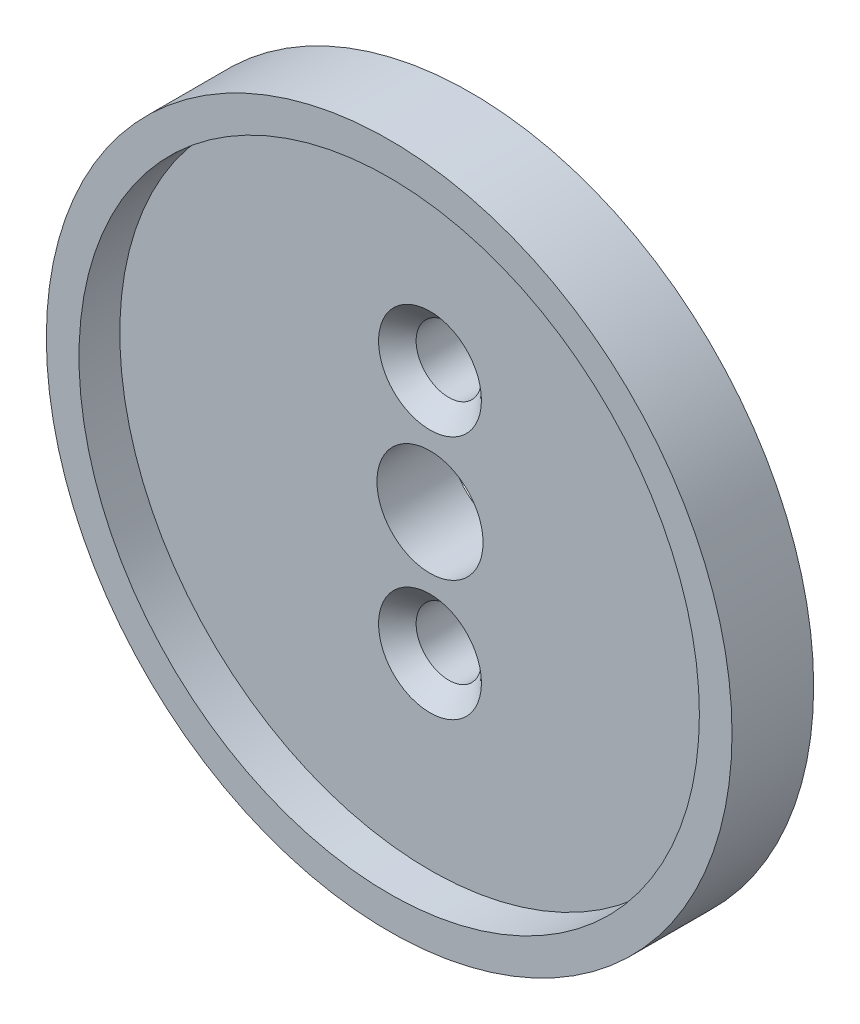
ISO-10303-21;
HEADER;
FILE_DESCRIPTION(('STEP AP214'),'2;1');
FILE_NAME('part.step','',(''),(''),'','','');
FILE_SCHEMA(('AUTOMOTIVE_DESIGN { 1 0 10303 214 1 1 1 1 }'));
ENDSEC;
DATA;
#1=APPLICATION_CONTEXT('core data for automotive mechanical design processes');
#2=APPLICATION_PROTOCOL_DEFINITION('international standard','automotive_design',2000,#1);
#3=PRODUCT_CONTEXT('',#1,'mechanical');
#4=PRODUCT('Part','Part','',(#3));
#5=PRODUCT_RELATED_PRODUCT_CATEGORY('part','',(#4));
#6=PRODUCT_DEFINITION_FORMATION('','',#4);
#7=PRODUCT_DEFINITION_CONTEXT('part definition',#1,'design');
#8=PRODUCT_DEFINITION('design','',#6,#7);
#9=PRODUCT_DEFINITION_SHAPE('','',#8);
#10=(LENGTH_UNIT() NAMED_UNIT(*) SI_UNIT(.MILLI.,.METRE.));
#11=(NAMED_UNIT(*) PLANE_ANGLE_UNIT() SI_UNIT($,.RADIAN.));
#12=(NAMED_UNIT(*) SI_UNIT($,.STERADIAN.) SOLID_ANGLE_UNIT());
#13=UNCERTAINTY_MEASURE_WITH_UNIT(LENGTH_MEASURE(1.E-05),#10,'distance_accuracy_value','');
#14=(GEOMETRIC_REPRESENTATION_CONTEXT(3) GLOBAL_UNCERTAINTY_ASSIGNED_CONTEXT((#13)) GLOBAL_UNIT_ASSIGNED_CONTEXT((#10,
#11,#12)) REPRESENTATION_CONTEXT('',''));
#15=CARTESIAN_POINT('',(0.,0.,0.));
#16=DIRECTION('',(0.,0.,1.));
#17=DIRECTION('',(1.,0.,0.));
#18=AXIS2_PLACEMENT_3D('',#15,#16,#17);
#19=CARTESIAN_POINT('',(12.5,-21.01,25.));
#20=DIRECTION('',(0.,0.,-1.));
#21=DIRECTION('',(-1.,0.,0.));
#22=AXIS2_PLACEMENT_3D('',#19,#20,#21);
#23=PLANE('',#22);
#24=CARTESIAN_POINT('',(0.,0.,25.));
#25=DIRECTION('',(0.,0.,-1.));
#26=DIRECTION('',(-1.,0.,0.));
#27=AXIS2_PLACEMENT_3D('',#24,#25,#26);
#28=CIRCLE('',#27,3.25);
#29=CARTESIAN_POINT('',(-3.25,0.,25.));
#30=VERTEX_POINT('',#29);
#31=EDGE_CURVE('E65',#30,#30,#28,.F.);
#32=ORIENTED_EDGE('',*,*,#31,.T.);
#33=EDGE_LOOP('',(#32));
#34=FACE_BOUND('',#33,.T.);
#35=CARTESIAN_POINT('',(0.,-7.5,25.));
#36=DIRECTION('',(0.,0.,-1.));
#37=DIRECTION('',(-1.,0.,0.));
#38=AXIS2_PLACEMENT_3D('',#35,#36,#37);
#39=CIRCLE('',#38,2.);
#40=CARTESIAN_POINT('',(-2.,-7.5,25.));
#41=VERTEX_POINT('',#40);
#42=EDGE_CURVE('E49',#41,#41,#39,.F.);
#43=ORIENTED_EDGE('',*,*,#42,.T.);
#44=EDGE_LOOP('',(#43));
#45=FACE_BOUND('',#44,.T.);
#46=CARTESIAN_POINT('',(0.,7.5,25.));
#47=DIRECTION('',(0.,0.,-1.));
#48=DIRECTION('',(-1.,0.,0.));
#49=AXIS2_PLACEMENT_3D('',#46,#47,#48);
#50=CIRCLE('',#49,2.);
#51=CARTESIAN_POINT('',(-2.,7.5,25.));
#52=VERTEX_POINT('',#51);
#53=EDGE_CURVE('E69',#52,#52,#50,.F.);
#54=ORIENTED_EDGE('',*,*,#53,.T.);
#55=EDGE_LOOP('',(#54));
#56=FACE_BOUND('',#55,.T.);
#57=CARTESIAN_POINT('',(0.,0.,25.));
#58=DIRECTION('',(0.,0.,-1.));
#59=DIRECTION('',(-1.,0.,0.));
#60=AXIS2_PLACEMENT_3D('',#57,#58,#59);
#61=CIRCLE('',#60,16.7109861589809);
#62=CARTESIAN_POINT('',(-16.7109861589809,0.,25.));
#63=VERTEX_POINT('',#62);
#64=EDGE_CURVE('E130',#63,#63,#61,.T.);
#65=ORIENTED_EDGE('',*,*,#64,.T.);
#66=EDGE_LOOP('',(#65));
#67=FACE_BOUND('',#66,.T.);
#68=ADVANCED_FACE('F45',(#34,#45,#56,#67),#23,.T.);
#69=CARTESIAN_POINT('',(0.,0.,29.5));
#70=DIRECTION('',(0.,0.,1.));
#71=DIRECTION('',(1.,0.,0.));
#72=AXIS2_PLACEMENT_3D('',#69,#70,#71);
#73=CYLINDRICAL_SURFACE('',#72,19.);
#74=CARTESIAN_POINT('',(0.,0.,29.5));
#75=DIRECTION('',(0.,0.,1.));
#76=DIRECTION('',(1.,0.,0.));
#77=AXIS2_PLACEMENT_3D('',#74,#75,#76);
#78=CIRCLE('',#77,19.);
#79=CARTESIAN_POINT('',(19.,0.,29.5));
#80=VERTEX_POINT('',#79);
#81=EDGE_CURVE('E145',#80,#80,#78,.T.);
#82=ORIENTED_EDGE('',*,*,#81,.F.);
#83=EDGE_LOOP('',(#82));
#84=FACE_BOUND('',#83,.T.);
#85=CARTESIAN_POINT('',(0.,0.,32.));
#86=DIRECTION('',(0.,0.,1.));
#87=DIRECTION('',(1.,0.,0.));
#88=AXIS2_PLACEMENT_3D('',#85,#86,#87);
#89=CIRCLE('',#88,19.);
#90=CARTESIAN_POINT('',(19.,0.,32.));
#91=VERTEX_POINT('',#90);
#92=EDGE_CURVE('E147',#91,#91,#89,.T.);
#93=ORIENTED_EDGE('',*,*,#92,.T.);
#94=EDGE_LOOP('',(#93));
#95=FACE_BOUND('',#94,.T.);
#96=ADVANCED_FACE('F94',(#84,#95),#73,.F.);
#97=CARTESIAN_POINT('',(0.,0.,29.5));
#98=DIRECTION('',(0.,0.,1.));
#99=DIRECTION('',(1.,0.,0.));
#100=AXIS2_PLACEMENT_3D('',#97,#98,#99);
#101=PLANE('',#100);
#102=CARTESIAN_POINT('',(0.,-7.5,29.5));
#103=DIRECTION('',(0.,0.,1.));
#104=DIRECTION('',(1.,0.,0.));
#105=AXIS2_PLACEMENT_3D('',#102,#103,#104);
#106=CIRCLE('',#105,3.15);
#107=CARTESIAN_POINT('',(3.15,-7.5,29.5));
#108=VERTEX_POINT('',#107);
#109=EDGE_CURVE('E10',#108,#108,#106,.T.);
#110=ORIENTED_EDGE('',*,*,#109,.F.);
#111=EDGE_LOOP('',(#110));
#112=FACE_BOUND('',#111,.T.);
#113=CARTESIAN_POINT('',(0.,7.5,29.5));
#114=DIRECTION('',(0.,0.,1.));
#115=DIRECTION('',(1.,0.,0.));
#116=AXIS2_PLACEMENT_3D('',#113,#114,#115);
#117=CIRCLE('',#116,3.15);
#118=CARTESIAN_POINT('',(3.15,7.5,29.5));
#119=VERTEX_POINT('',#118);
#120=EDGE_CURVE('E60',#119,#119,#117,.T.);
#121=ORIENTED_EDGE('',*,*,#120,.F.);
#122=EDGE_LOOP('',(#121));
#123=FACE_BOUND('',#122,.T.);
#124=ORIENTED_EDGE('',*,*,#81,.T.);
#125=EDGE_LOOP('',(#124));
#126=FACE_BOUND('',#125,.T.);
#127=CARTESIAN_POINT('',(0.,0.,29.5));
#128=DIRECTION('',(0.,0.,1.));
#129=DIRECTION('',(1.,0.,0.));
#130=AXIS2_PLACEMENT_3D('',#127,#128,#129);
#131=CIRCLE('',#130,3.25);
#132=CARTESIAN_POINT('',(3.25,0.,29.5));
#133=VERTEX_POINT('',#132);
#134=EDGE_CURVE('E138',#133,#133,#131,.F.);
#135=ORIENTED_EDGE('',*,*,#134,.T.);
#136=EDGE_LOOP('',(#135));
#137=FACE_BOUND('',#136,.T.);
#138=ADVANCED_FACE('F96',(#112,#123,#126,#137),#101,.T.);
#139=CARTESIAN_POINT('',(0.,0.,7.));
#140=DIRECTION('',(0.,0.,1.));
#141=DIRECTION('',(1.,0.,0.));
#142=AXIS2_PLACEMENT_3D('',#139,#140,#141);
#143=CYLINDRICAL_SURFACE('',#142,3.25);
#144=ORIENTED_EDGE('',*,*,#134,.F.);
#145=EDGE_LOOP('',(#144));
#146=FACE_BOUND('',#145,.T.);
#147=ORIENTED_EDGE('',*,*,#31,.F.);
#148=EDGE_LOOP('',(#147));
#149=FACE_BOUND('',#148,.T.);
#150=ADVANCED_FACE('F47',(#146,#149),#143,.F.);
#151=CARTESIAN_POINT('',(0.,-7.5,29.5));
#152=DIRECTION('',(0.,0.,1.));
#153=DIRECTION('',(1.,0.,0.));
#154=AXIS2_PLACEMENT_3D('',#151,#152,#153);
#155=CONICAL_SURFACE('',#154,3.15,0.785398163397449);
#156=ORIENTED_EDGE('',*,*,#109,.T.);
#157=EDGE_LOOP('',(#156));
#158=FACE_BOUND('',#157,.T.);
#159=CARTESIAN_POINT('',(0.,-7.5,28.35));
#160=DIRECTION('',(0.,0.,1.));
#161=DIRECTION('',(1.,0.,0.));
#162=AXIS2_PLACEMENT_3D('',#159,#160,#161);
#163=CIRCLE('',#162,2.);
#164=CARTESIAN_POINT('',(2.,-7.5,28.35));
#165=VERTEX_POINT('',#164);
#166=EDGE_CURVE('E54',#165,#165,#163,.T.);
#167=ORIENTED_EDGE('',*,*,#166,.F.);
#168=EDGE_LOOP('',(#167));
#169=FACE_BOUND('',#168,.T.);
#170=ADVANCED_FACE('F82',(#158,#169),#155,.F.);
#171=CARTESIAN_POINT('',(0.,-7.5,12.5));
#172=DIRECTION('',(0.,0.,1.));
#173=DIRECTION('',(1.,0.,0.));
#174=AXIS2_PLACEMENT_3D('',#171,#172,#173);
#175=CYLINDRICAL_SURFACE('',#174,2.);
#176=ORIENTED_EDGE('',*,*,#166,.T.);
#177=EDGE_LOOP('',(#176));
#178=FACE_BOUND('',#177,.T.);
#179=ORIENTED_EDGE('',*,*,#42,.F.);
#180=EDGE_LOOP('',(#179));
#181=FACE_BOUND('',#180,.T.);
#182=ADVANCED_FACE('F79',(#178,#181),#175,.F.);
#183=CARTESIAN_POINT('',(0.,7.5,29.5));
#184=DIRECTION('',(0.,0.,1.));
#185=DIRECTION('',(1.,0.,0.));
#186=AXIS2_PLACEMENT_3D('',#183,#184,#185);
#187=CONICAL_SURFACE('',#186,3.15,0.785398163397449);
#188=ORIENTED_EDGE('',*,*,#120,.T.);
#189=EDGE_LOOP('',(#188));
#190=FACE_BOUND('',#189,.T.);
#191=CARTESIAN_POINT('',(0.,7.5,28.35));
#192=DIRECTION('',(0.,0.,1.));
#193=DIRECTION('',(1.,0.,0.));
#194=AXIS2_PLACEMENT_3D('',#191,#192,#193);
#195=CIRCLE('',#194,2.);
#196=CARTESIAN_POINT('',(2.,7.5,28.35));
#197=VERTEX_POINT('',#196);
#198=EDGE_CURVE('E150',#197,#197,#195,.T.);
#199=ORIENTED_EDGE('',*,*,#198,.F.);
#200=EDGE_LOOP('',(#199));
#201=FACE_BOUND('',#200,.T.);
#202=ADVANCED_FACE('F81',(#190,#201),#187,.F.);
#203=CARTESIAN_POINT('',(0.,7.5,12.5));
#204=DIRECTION('',(0.,0.,1.));
#205=DIRECTION('',(1.,0.,0.));
#206=AXIS2_PLACEMENT_3D('',#203,#204,#205);
#207=CYLINDRICAL_SURFACE('',#206,2.);
#208=ORIENTED_EDGE('',*,*,#198,.T.);
#209=EDGE_LOOP('',(#208));
#210=FACE_BOUND('',#209,.T.);
#211=ORIENTED_EDGE('',*,*,#53,.F.);
#212=EDGE_LOOP('',(#211));
#213=FACE_BOUND('',#212,.T.);
#214=ADVANCED_FACE('F89',(#210,#213),#207,.F.);
#215=CARTESIAN_POINT('',(0.,12.5,32.));
#216=DIRECTION('',(0.,0.,1.));
#217=DIRECTION('',(1.,0.,0.));
#218=AXIS2_PLACEMENT_3D('',#215,#216,#217);
#219=PLANE('',#218);
#220=ORIENTED_EDGE('',*,*,#92,.F.);
#221=EDGE_LOOP('',(#220));
#222=FACE_BOUND('',#221,.T.);
#223=CARTESIAN_POINT('',(0.,0.,32.));
#224=DIRECTION('',(0.,0.,-1.));
#225=DIRECTION('',(-1.,0.,0.));
#226=AXIS2_PLACEMENT_3D('',#223,#224,#225);
#227=CIRCLE('',#226,21.);
#228=CARTESIAN_POINT('',(-21.,0.,32.));
#229=VERTEX_POINT('',#228);
#230=EDGE_CURVE('E133',#229,#229,#227,.T.);
#231=ORIENTED_EDGE('',*,*,#230,.F.);
#232=EDGE_LOOP('',(#231));
#233=FACE_BOUND('',#232,.T.);
#234=ADVANCED_FACE('F110',(#222,#233),#219,.T.);
#235=CARTESIAN_POINT('',(0.,0.,0.));
#236=DIRECTION('',(0.,0.,-1.));
#237=DIRECTION('',(-1.,0.,0.));
#238=AXIS2_PLACEMENT_3D('',#235,#236,#237);
#239=CYLINDRICAL_SURFACE('',#238,21.);
#240=CARTESIAN_POINT('',(0.,0.,27.));
#241=DIRECTION('',(0.,0.,-1.));
#242=DIRECTION('',(-1.,0.,0.));
#243=AXIS2_PLACEMENT_3D('',#240,#241,#242);
#244=CIRCLE('',#243,21.);
#245=CARTESIAN_POINT('',(-21.,0.,27.));
#246=VERTEX_POINT('',#245);
#247=EDGE_CURVE('E68',#246,#246,#244,.F.);
#248=ORIENTED_EDGE('',*,*,#247,.T.);
#249=EDGE_LOOP('',(#248));
#250=FACE_BOUND('',#249,.T.);
#251=ORIENTED_EDGE('',*,*,#230,.T.);
#252=EDGE_LOOP('',(#251));
#253=FACE_BOUND('',#252,.T.);
#254=ADVANCED_FACE('F113',(#250,#253),#239,.T.);
#255=CARTESIAN_POINT('',(0.,0.,25.));
#256=DIRECTION('',(0.,0.,1.));
#257=DIRECTION('',(1.,0.,0.));
#258=AXIS2_PLACEMENT_3D('',#255,#256,#257);
#259=CONICAL_SURFACE('',#258,16.7109861589809,1.13446401379631);
#260=ORIENTED_EDGE('',*,*,#247,.F.);
#261=EDGE_LOOP('',(#260));
#262=FACE_BOUND('',#261,.T.);
#263=ORIENTED_EDGE('',*,*,#64,.F.);
#264=EDGE_LOOP('',(#263));
#265=FACE_BOUND('',#264,.T.);
#266=ADVANCED_FACE('F106',(#262,#265),#259,.T.);
#267=CLOSED_SHELL('',(#68,#96,#138,#150,#170,#182,#202,#214,#234,#254,#266));
#268=MANIFOLD_SOLID_BREP('B2',#267);
#269=ADVANCED_BREP_SHAPE_REPRESENTATION('',(#18,#268),#14);
#270=SHAPE_DEFINITION_REPRESENTATION(#9,#269);
ENDSEC;
END-ISO-10303-21;
